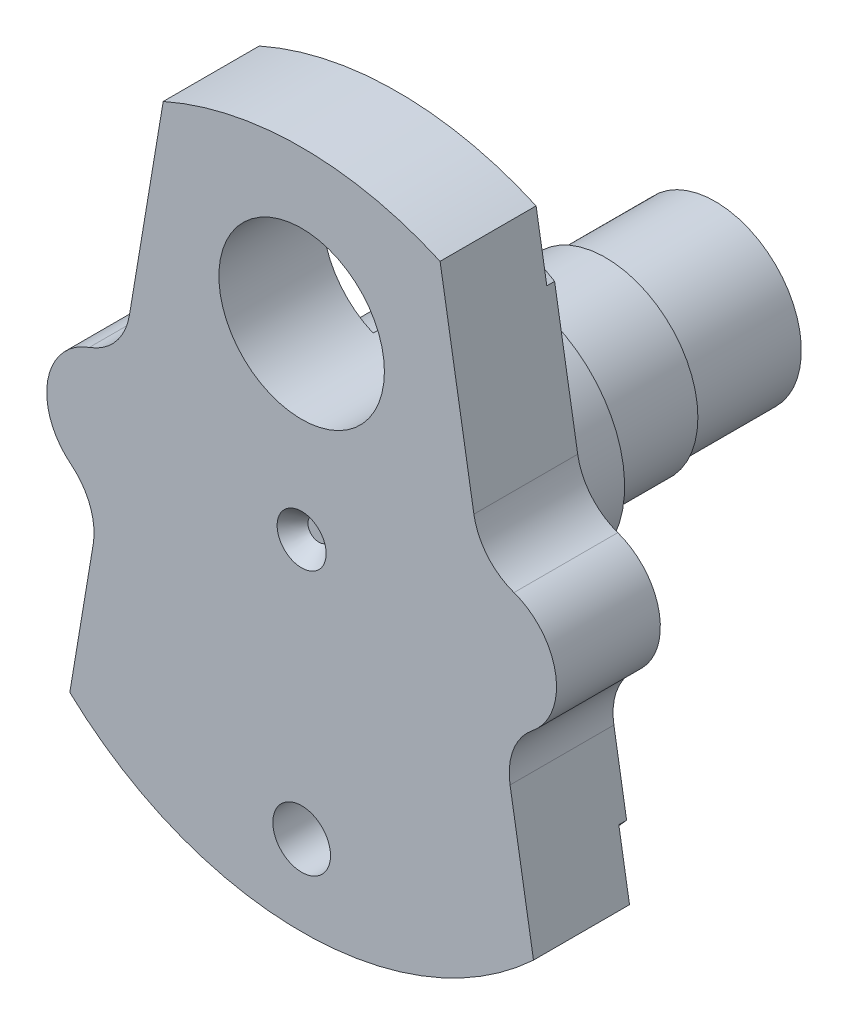
ISO-10303-21;
HEADER;
FILE_DESCRIPTION(('STEP AP214'),'2;1');
FILE_NAME('part.step','',(''),(''),'','','');
FILE_SCHEMA(('AUTOMOTIVE_DESIGN { 1 0 10303 214 1 1 1 1 }'));
ENDSEC;
DATA;
#1=APPLICATION_CONTEXT('core data for automotive mechanical design processes');
#2=APPLICATION_PROTOCOL_DEFINITION('international standard','automotive_design',2000,#1);
#3=PRODUCT_CONTEXT('',#1,'mechanical');
#4=PRODUCT('Part','Part','',(#3));
#5=PRODUCT_RELATED_PRODUCT_CATEGORY('part','',(#4));
#6=PRODUCT_DEFINITION_FORMATION('','',#4);
#7=PRODUCT_DEFINITION_CONTEXT('part definition',#1,'design');
#8=PRODUCT_DEFINITION('design','',#6,#7);
#9=PRODUCT_DEFINITION_SHAPE('','',#8);
#10=(LENGTH_UNIT() NAMED_UNIT(*) SI_UNIT(.MILLI.,.METRE.));
#11=(NAMED_UNIT(*) PLANE_ANGLE_UNIT() SI_UNIT($,.RADIAN.));
#12=(NAMED_UNIT(*) SI_UNIT($,.STERADIAN.) SOLID_ANGLE_UNIT());
#13=UNCERTAINTY_MEASURE_WITH_UNIT(LENGTH_MEASURE(1.E-05),#10,'distance_accuracy_value','');
#14=(GEOMETRIC_REPRESENTATION_CONTEXT(3) GLOBAL_UNCERTAINTY_ASSIGNED_CONTEXT((#13)) GLOBAL_UNIT_ASSIGNED_CONTEXT((#10,
#11,#12)) REPRESENTATION_CONTEXT('',''));
#15=CARTESIAN_POINT('',(0.,0.,0.));
#16=DIRECTION('',(0.,0.,1.));
#17=DIRECTION('',(1.,0.,0.));
#18=AXIS2_PLACEMENT_3D('',#15,#16,#17);
#19=CARTESIAN_POINT('',(36.1365206861808,-18.7744784222295,-18.));
#20=DIRECTION('',(0.986305164893653,0.164930657259661,0.));
#21=DIRECTION('',(-0.164930657259661,0.986305164893653,0.));
#22=AXIS2_PLACEMENT_3D('',#19,#20,#21);
#23=PLANE('',#22);
#24=DIRECTION('',(0.,0.,1.));
#25=VECTOR('',#24,1.);
#26=CARTESIAN_POINT('',(40.1957522810744,-43.0491715209165,-18.));
#27=LINE('',#26,#25);
#28=CARTESIAN_POINT('',(40.1957522810744,-43.0491715209165,-16.65));
#29=VERTEX_POINT('',#28);
#30=CARTESIAN_POINT('',(40.1957522810744,-43.0491715209165,0.));
#31=VERTEX_POINT('',#30);
#32=EDGE_CURVE('E204',#29,#31,#27,.T.);
#33=ORIENTED_EDGE('',*,*,#32,.F.);
#34=DIRECTION('',(-0.164930657259661,0.986305164893653,0.));
#35=VECTOR('',#34,1.);
#36=CARTESIAN_POINT('',(36.1365206861808,-18.7744784222295,-16.65));
#37=LINE('',#36,#35);
#38=CARTESIAN_POINT('',(38.3431689216786,-31.9705002409534,-16.65));
#39=VERTEX_POINT('',#38);
#40=EDGE_CURVE('E367',#29,#39,#37,.T.);
#41=ORIENTED_EDGE('',*,*,#40,.T.);
#42=DIRECTION('',(0.,0.,-1.));
#43=VECTOR('',#42,1.);
#44=CARTESIAN_POINT('',(38.3431689216786,-31.9705002409534,-16.65));
#45=LINE('',#44,#43);
#46=CARTESIAN_POINT('',(38.3431689216787,-31.9705002409534,-18.));
#47=VERTEX_POINT('',#46);
#48=EDGE_CURVE('E352',#39,#47,#45,.T.);
#49=ORIENTED_EDGE('',*,*,#48,.T.);
#50=DIRECTION('',(-0.164930657259661,0.986305164893653,0.));
#51=VECTOR('',#50,1.);
#52=CARTESIAN_POINT('',(36.1365206861808,-18.7744784222295,-18.));
#53=LINE('',#52,#51);
#54=CARTESIAN_POINT('',(36.1365206861808,-18.7744784222295,-18.));
#55=VERTEX_POINT('',#54);
#56=EDGE_CURVE('E249',#47,#55,#53,.T.);
#57=ORIENTED_EDGE('',*,*,#56,.T.);
#58=DIRECTION('',(0.,0.,1.));
#59=VECTOR('',#58,1.);
#60=CARTESIAN_POINT('',(36.1365206861808,-18.7744784222295,-18.));
#61=LINE('',#60,#59);
#62=CARTESIAN_POINT('',(36.1365206861808,-18.7744784222295,0.));
#63=VERTEX_POINT('',#62);
#64=EDGE_CURVE('E200',#55,#63,#61,.T.);
#65=ORIENTED_EDGE('',*,*,#64,.T.);
#66=DIRECTION('',(-0.164930657259661,0.986305164893653,0.));
#67=VECTOR('',#66,1.);
#68=CARTESIAN_POINT('',(36.1365206861808,-18.7744784222295,0.));
#69=LINE('',#68,#67);
#70=EDGE_CURVE('E226',#31,#63,#69,.T.);
#71=ORIENTED_EDGE('',*,*,#70,.F.);
#72=EDGE_LOOP('',(#33,#41,#49,#57,#65,#71));
#73=FACE_BOUND('',#72,.T.);
#74=ADVANCED_FACE('F45',(#73),#23,.T.);
#75=CARTESIAN_POINT('',(0.,0.,-18.));
#76=DIRECTION('',(0.,0.,1.));
#77=DIRECTION('',(1.,0.,0.));
#78=AXIS2_PLACEMENT_3D('',#75,#76,#77);
#79=CYLINDRICAL_SURFACE('',#78,58.8976202412184);
#80=DIRECTION('',(0.,0.,1.));
#81=VECTOR('',#80,1.);
#82=CARTESIAN_POINT('',(-40.1957522810744,-43.0491715209165,-18.));
#83=LINE('',#82,#81);
#84=CARTESIAN_POINT('',(-40.1957522810744,-43.0491715209165,-16.65));
#85=VERTEX_POINT('',#84);
#86=CARTESIAN_POINT('',(-40.1957522810744,-43.0491715209165,0.));
#87=VERTEX_POINT('',#86);
#88=EDGE_CURVE('E287',#85,#87,#83,.T.);
#89=ORIENTED_EDGE('',*,*,#88,.F.);
#90=CARTESIAN_POINT('',(0.,0.,-16.65));
#91=DIRECTION('',(0.,0.,-1.));
#92=DIRECTION('',(-1.,0.,0.));
#93=AXIS2_PLACEMENT_3D('',#90,#91,#92);
#94=CIRCLE('',#93,58.8976202412184);
#95=EDGE_CURVE('E364',#85,#29,#94,.F.);
#96=ORIENTED_EDGE('',*,*,#95,.T.);
#97=ORIENTED_EDGE('',*,*,#32,.T.);
#98=CARTESIAN_POINT('',(0.,0.,0.));
#99=DIRECTION('',(0.,0.,1.));
#100=DIRECTION('',(1.,0.,0.));
#101=AXIS2_PLACEMENT_3D('',#98,#99,#100);
#102=CIRCLE('',#101,58.8976202412184);
#103=EDGE_CURVE('E281',#87,#31,#102,.T.);
#104=ORIENTED_EDGE('',*,*,#103,.F.);
#105=EDGE_LOOP('',(#89,#96,#97,#104));
#106=FACE_BOUND('',#105,.T.);
#107=ADVANCED_FACE('F401',(#106),#79,.T.);
#108=CARTESIAN_POINT('',(-36.1365206861809,-18.7744784222295,-18.));
#109=DIRECTION('',(-0.986305164893653,0.16493065725966,0.));
#110=DIRECTION('',(-0.16493065725966,-0.986305164893653,0.));
#111=AXIS2_PLACEMENT_3D('',#108,#109,#110);
#112=PLANE('',#111);
#113=DIRECTION('',(0.,0.,-1.));
#114=VECTOR('',#113,1.);
#115=CARTESIAN_POINT('',(-38.3431689216786,-31.9705002409534,-16.65));
#116=LINE('',#115,#114);
#117=CARTESIAN_POINT('',(-38.3431689216786,-31.9705002409534,-18.));
#118=VERTEX_POINT('',#117);
#119=CARTESIAN_POINT('',(-38.3431689216786,-31.9705002409534,-16.65));
#120=VERTEX_POINT('',#119);
#121=EDGE_CURVE('E350',#118,#120,#116,.F.);
#122=ORIENTED_EDGE('',*,*,#121,.T.);
#123=DIRECTION('',(-0.16493065725966,-0.986305164893653,0.));
#124=VECTOR('',#123,1.);
#125=CARTESIAN_POINT('',(-36.1365206861809,-18.7744784222295,-16.65));
#126=LINE('',#125,#124);
#127=EDGE_CURVE('E329',#120,#85,#126,.T.);
#128=ORIENTED_EDGE('',*,*,#127,.T.);
#129=ORIENTED_EDGE('',*,*,#88,.T.);
#130=DIRECTION('',(-0.16493065725966,-0.986305164893653,0.));
#131=VECTOR('',#130,1.);
#132=CARTESIAN_POINT('',(-36.1365206861809,-18.7744784222295,0.));
#133=LINE('',#132,#131);
#134=CARTESIAN_POINT('',(-36.1365206861809,-18.7744784222295,0.));
#135=VERTEX_POINT('',#134);
#136=EDGE_CURVE('E278',#135,#87,#133,.T.);
#137=ORIENTED_EDGE('',*,*,#136,.F.);
#138=DIRECTION('',(0.,0.,1.));
#139=VECTOR('',#138,1.);
#140=CARTESIAN_POINT('',(-36.1365206861809,-18.7744784222295,-18.));
#141=LINE('',#140,#139);
#142=CARTESIAN_POINT('',(-36.1365206861809,-18.7744784222295,-18.));
#143=VERTEX_POINT('',#142);
#144=EDGE_CURVE('E289',#143,#135,#141,.T.);
#145=ORIENTED_EDGE('',*,*,#144,.F.);
#146=DIRECTION('',(-0.16493065725966,-0.986305164893653,0.));
#147=VECTOR('',#146,1.);
#148=CARTESIAN_POINT('',(-36.1365206861809,-18.7744784222295,-18.));
#149=LINE('',#148,#147);
#150=EDGE_CURVE('E246',#143,#118,#149,.T.);
#151=ORIENTED_EDGE('',*,*,#150,.T.);
#152=EDGE_LOOP('',(#122,#128,#129,#137,#145,#151));
#153=FACE_BOUND('',#152,.T.);
#154=ADVANCED_FACE('F408',(#153),#112,.T.);
#155=CARTESIAN_POINT('',(-24.0031466517319,53.7845574574546,-18.));
#156=DIRECTION('',(-0.986305164893653,0.164930657259659,0.));
#157=DIRECTION('',(-0.164930657259659,-0.986305164893653,0.));
#158=AXIS2_PLACEMENT_3D('',#155,#156,#157);
#159=PLANE('',#158);
#160=DIRECTION('',(0.,0.,1.));
#161=VECTOR('',#160,1.);
#162=CARTESIAN_POINT('',(-24.0031466517319,53.7845574574546,-18.));
#163=LINE('',#162,#161);
#164=CARTESIAN_POINT('',(-24.0031466517319,53.7845574574546,-16.65));
#165=VERTEX_POINT('',#164);
#166=CARTESIAN_POINT('',(-24.0031466517319,53.7845574574546,0.));
#167=VERTEX_POINT('',#166);
#168=EDGE_CURVE('E297',#165,#167,#163,.T.);
#169=ORIENTED_EDGE('',*,*,#168,.F.);
#170=DIRECTION('',(-0.164930657259659,-0.986305164893653,0.));
#171=VECTOR('',#170,1.);
#172=CARTESIAN_POINT('',(-24.0031466517319,53.7845574574546,-16.65));
#173=LINE('',#172,#171);
#174=CARTESIAN_POINT('',(-25.8557300111277,42.7058861774915,-16.65));
#175=VERTEX_POINT('',#174);
#176=EDGE_CURVE('E360',#165,#175,#173,.T.);
#177=ORIENTED_EDGE('',*,*,#176,.T.);
#178=DIRECTION('',(0.,0.,-1.));
#179=VECTOR('',#178,1.);
#180=CARTESIAN_POINT('',(-25.8557300111276,42.7058861774915,-16.65));
#181=LINE('',#180,#179);
#182=CARTESIAN_POINT('',(-25.8557300111276,42.7058861774915,-18.));
#183=VERTEX_POINT('',#182);
#184=EDGE_CURVE('E347',#175,#183,#181,.T.);
#185=ORIENTED_EDGE('',*,*,#184,.T.);
#186=DIRECTION('',(-0.164930657259659,-0.986305164893653,0.));
#187=VECTOR('',#186,1.);
#188=CARTESIAN_POINT('',(-24.0031466517319,53.7845574574546,-18.));
#189=LINE('',#188,#187);
#190=CARTESIAN_POINT('',(-29.8621091350193,18.747257211408,-18.));
#191=VERTEX_POINT('',#190);
#192=EDGE_CURVE('E235',#183,#191,#189,.T.);
#193=ORIENTED_EDGE('',*,*,#192,.T.);
#194=DIRECTION('',(0.,0.,1.));
#195=VECTOR('',#194,1.);
#196=CARTESIAN_POINT('',(-29.8621091350193,18.747257211408,-18.));
#197=LINE('',#196,#195);
#198=CARTESIAN_POINT('',(-29.8621091350193,18.747257211408,0.));
#199=VERTEX_POINT('',#198);
#200=EDGE_CURVE('E295',#191,#199,#197,.T.);
#201=ORIENTED_EDGE('',*,*,#200,.T.);
#202=DIRECTION('',(-0.164930657259659,-0.986305164893653,0.));
#203=VECTOR('',#202,1.);
#204=CARTESIAN_POINT('',(-24.0031466517319,53.7845574574546,0.));
#205=LINE('',#204,#203);
#206=EDGE_CURVE('E266',#167,#199,#205,.T.);
#207=ORIENTED_EDGE('',*,*,#206,.F.);
#208=EDGE_LOOP('',(#169,#177,#185,#193,#201,#207));
#209=FACE_BOUND('',#208,.T.);
#210=ADVANCED_FACE('F416',(#209),#159,.T.);
#211=CARTESIAN_POINT('',(0.,0.,-18.));
#212=DIRECTION('',(0.,0.,1.));
#213=DIRECTION('',(1.,0.,0.));
#214=AXIS2_PLACEMENT_3D('',#211,#212,#213);
#215=CYLINDRICAL_SURFACE('',#214,58.8976202412184);
#216=DIRECTION('',(0.,0.,1.));
#217=VECTOR('',#216,1.);
#218=CARTESIAN_POINT('',(24.0031466517319,53.7845574574546,-18.));
#219=LINE('',#218,#217);
#220=CARTESIAN_POINT('',(24.0031466517319,53.7845574574546,-16.65));
#221=VERTEX_POINT('',#220);
#222=CARTESIAN_POINT('',(24.0031466517319,53.7845574574546,0.));
#223=VERTEX_POINT('',#222);
#224=EDGE_CURVE('E299',#221,#223,#219,.T.);
#225=ORIENTED_EDGE('',*,*,#224,.F.);
#226=CARTESIAN_POINT('',(0.,0.,-16.65));
#227=DIRECTION('',(0.,0.,-1.));
#228=DIRECTION('',(-1.,0.,0.));
#229=AXIS2_PLACEMENT_3D('',#226,#227,#228);
#230=CIRCLE('',#229,58.8976202412184);
#231=EDGE_CURVE('E357',#221,#165,#230,.F.);
#232=ORIENTED_EDGE('',*,*,#231,.T.);
#233=ORIENTED_EDGE('',*,*,#168,.T.);
#234=CARTESIAN_POINT('',(0.,0.,0.));
#235=DIRECTION('',(0.,0.,1.));
#236=DIRECTION('',(1.,0.,0.));
#237=AXIS2_PLACEMENT_3D('',#234,#235,#236);
#238=CIRCLE('',#237,58.8976202412184);
#239=EDGE_CURVE('E263',#223,#167,#238,.T.);
#240=ORIENTED_EDGE('',*,*,#239,.F.);
#241=EDGE_LOOP('',(#225,#232,#233,#240));
#242=FACE_BOUND('',#241,.T.);
#243=ADVANCED_FACE('F433',(#242),#215,.T.);
#244=CARTESIAN_POINT('',(24.0031466517319,53.7845574574546,-18.));
#245=DIRECTION('',(0.986305164893653,0.16493065725966,0.));
#246=DIRECTION('',(-0.16493065725966,0.986305164893653,0.));
#247=AXIS2_PLACEMENT_3D('',#244,#245,#246);
#248=PLANE('',#247);
#249=DIRECTION('',(0.,0.,-1.));
#250=VECTOR('',#249,1.);
#251=CARTESIAN_POINT('',(25.8557300111276,42.7058861774915,-16.65));
#252=LINE('',#251,#250);
#253=CARTESIAN_POINT('',(25.8557300111276,42.7058861774915,-18.));
#254=VERTEX_POINT('',#253);
#255=CARTESIAN_POINT('',(25.8557300111276,42.7058861774915,-16.65));
#256=VERTEX_POINT('',#255);
#257=EDGE_CURVE('E67',#254,#256,#252,.F.);
#258=ORIENTED_EDGE('',*,*,#257,.T.);
#259=DIRECTION('',(-0.16493065725966,0.986305164893653,0.));
#260=VECTOR('',#259,1.);
#261=CARTESIAN_POINT('',(24.0031466517319,53.7845574574546,-16.65));
#262=LINE('',#261,#260);
#263=EDGE_CURVE('E354',#256,#221,#262,.T.);
#264=ORIENTED_EDGE('',*,*,#263,.T.);
#265=ORIENTED_EDGE('',*,*,#224,.T.);
#266=DIRECTION('',(-0.16493065725966,0.986305164893653,0.));
#267=VECTOR('',#266,1.);
#268=CARTESIAN_POINT('',(24.0031466517319,53.7845574574546,0.));
#269=LINE('',#268,#267);
#270=CARTESIAN_POINT('',(29.8621091350193,18.747257211408,0.));
#271=VERTEX_POINT('',#270);
#272=EDGE_CURVE('E260',#271,#223,#269,.T.);
#273=ORIENTED_EDGE('',*,*,#272,.F.);
#274=DIRECTION('',(0.,0.,1.));
#275=VECTOR('',#274,1.);
#276=CARTESIAN_POINT('',(29.8621091350193,18.747257211408,-18.));
#277=LINE('',#276,#275);
#278=CARTESIAN_POINT('',(29.8621091350193,18.747257211408,-18.));
#279=VERTEX_POINT('',#278);
#280=EDGE_CURVE('E301',#279,#271,#277,.T.);
#281=ORIENTED_EDGE('',*,*,#280,.F.);
#282=DIRECTION('',(-0.16493065725966,0.986305164893653,0.));
#283=VECTOR('',#282,1.);
#284=CARTESIAN_POINT('',(24.0031466517319,53.7845574574546,-18.));
#285=LINE('',#284,#283);
#286=EDGE_CURVE('E232',#279,#254,#285,.T.);
#287=ORIENTED_EDGE('',*,*,#286,.T.);
#288=EDGE_LOOP('',(#258,#264,#265,#273,#281,#287));
#289=FACE_BOUND('',#288,.T.);
#290=ADVANCED_FACE('F437',(#289),#248,.T.);
#291=CARTESIAN_POINT('',(46.6541045117622,-17.0157205094858,-18.));
#292=DIRECTION('',(0.,0.,1.));
#293=DIRECTION('',(1.,0.,0.));
#294=AXIS2_PLACEMENT_3D('',#291,#292,#293);
#295=PLANE('',#294);
#296=CARTESIAN_POINT('',(0.,0.,-18.));
#297=DIRECTION('',(0.,0.,-1.));
#298=DIRECTION('',(-1.,0.,0.));
#299=AXIS2_PLACEMENT_3D('',#296,#297,#298);
#300=CIRCLE('',#299,20.);
#301=CARTESIAN_POINT('',(5.61703536948605,19.1950231481481,-18.));
#302=VERTEX_POINT('',#301);
#303=CARTESIAN_POINT('',(-5.61703536948605,19.1950231481481,-18.));
#304=VERTEX_POINT('',#303);
#305=EDGE_CURVE('E197',#302,#304,#300,.T.);
#306=ORIENTED_EDGE('',*,*,#305,.F.);
#307=CARTESIAN_POINT('',(0.,32.4,-18.));
#308=DIRECTION('',(0.,0.,1.));
#309=DIRECTION('',(1.,0.,0.));
#310=AXIS2_PLACEMENT_3D('',#307,#308,#309);
#311=CIRCLE('',#310,14.35);
#312=EDGE_CURVE('E217',#302,#304,#311,.T.);
#313=ORIENTED_EDGE('',*,*,#312,.T.);
#314=EDGE_LOOP('',(#306,#313));
#315=FACE_BOUND('',#314,.T.);
#316=CARTESIAN_POINT('',(0.,0.,-18.));
#317=DIRECTION('',(0.,0.,-1.));
#318=DIRECTION('',(-1.,0.,0.));
#319=AXIS2_PLACEMENT_3D('',#316,#317,#318);
#320=CIRCLE('',#319,49.9230556818509);
#321=EDGE_CURVE('E331',#183,#254,#320,.T.);
#322=ORIENTED_EDGE('',*,*,#321,.T.);
#323=ORIENTED_EDGE('',*,*,#286,.F.);
#324=CARTESIAN_POINT('',(40.3903600661843,20.5077988852001,-18.));
#325=DIRECTION('',(0.,0.,-1.));
#326=DIRECTION('',(-1.,0.,0.));
#327=AXIS2_PLACEMENT_3D('',#324,#325,#326);
#328=CIRCLE('',#327,10.674435566096);
#329=CARTESIAN_POINT('',(36.8148877410866,10.4499873783564,-18.));
#330=VERTEX_POINT('',#329);
#331=EDGE_CURVE('E229',#330,#279,#328,.T.);
#332=ORIENTED_EDGE('',*,*,#331,.F.);
#333=CARTESIAN_POINT('',(33.1,0.,-18.));
#334=DIRECTION('',(0.,0.,1.));
#335=DIRECTION('',(-1.,0.,0.));
#336=AXIS2_PLACEMENT_3D('',#333,#334,#335);
#337=CIRCLE('',#336,11.0906549462457);
#338=CARTESIAN_POINT('',(40.0100852229209,-8.67486883754763,-18.));
#339=VERTEX_POINT('',#338);
#340=EDGE_CURVE('E225',#339,#330,#337,.T.);
#341=ORIENTED_EDGE('',*,*,#340,.F.);
#342=CARTESIAN_POINT('',(46.6541045117622,-17.0157205094858,-18.));
#343=DIRECTION('',(0.,0.,-1.));
#344=DIRECTION('',(1.,0.,0.));
#345=AXIS2_PLACEMENT_3D('',#342,#343,#344);
#346=CIRCLE('',#345,10.6636203478823);
#347=EDGE_CURVE('E222',#55,#339,#346,.T.);
#348=ORIENTED_EDGE('',*,*,#347,.F.);
#349=ORIENTED_EDGE('',*,*,#56,.F.);
#350=CARTESIAN_POINT('',(0.55115890773041,-49.9200131457476,-18.));
#351=VERTEX_POINT('',#350);
#352=EDGE_CURVE('E338',#47,#351,#320,.T.);
#353=ORIENTED_EDGE('',*,*,#352,.T.);
#354=CARTESIAN_POINT('',(0.00437996724736428,-44.9499997866061,-18.));
#355=DIRECTION('',(0.,0.,1.));
#356=DIRECTION('',(1.,0.,0.));
#357=AXIS2_PLACEMENT_3D('',#354,#355,#356);
#358=CIRCLE('',#357,4.9999999999801);
#359=CARTESIAN_POINT('',(-0.541430397974819,-49.920119608604,-18.));
#360=VERTEX_POINT('',#359);
#361=EDGE_CURVE('E210',#351,#360,#358,.T.);
#362=ORIENTED_EDGE('',*,*,#361,.T.);
#363=EDGE_CURVE('E191',#360,#118,#320,.T.);
#364=ORIENTED_EDGE('',*,*,#363,.T.);
#365=ORIENTED_EDGE('',*,*,#150,.F.);
#366=CARTESIAN_POINT('',(-46.6541045117622,-17.0157205094858,-18.));
#367=DIRECTION('',(0.,0.,-1.));
#368=DIRECTION('',(-1.,0.,0.));
#369=AXIS2_PLACEMENT_3D('',#366,#367,#368);
#370=CIRCLE('',#369,10.6636203478823);
#371=CARTESIAN_POINT('',(-40.0100852229209,-8.67486883754765,-18.));
#372=VERTEX_POINT('',#371);
#373=EDGE_CURVE('E243',#372,#143,#370,.T.);
#374=ORIENTED_EDGE('',*,*,#373,.F.);
#375=CARTESIAN_POINT('',(-33.1,0.,-18.));
#376=DIRECTION('',(0.,0.,1.));
#377=DIRECTION('',(1.,0.,0.));
#378=AXIS2_PLACEMENT_3D('',#375,#376,#377);
#379=CIRCLE('',#378,11.0906549462457);
#380=CARTESIAN_POINT('',(-36.8148877410867,10.4499873783565,-18.));
#381=VERTEX_POINT('',#380);
#382=EDGE_CURVE('E240',#381,#372,#379,.T.);
#383=ORIENTED_EDGE('',*,*,#382,.F.);
#384=CARTESIAN_POINT('',(-40.3903600661843,20.5077988852001,-18.));
#385=DIRECTION('',(0.,0.,-1.));
#386=DIRECTION('',(1.,0.,0.));
#387=AXIS2_PLACEMENT_3D('',#384,#385,#386);
#388=CIRCLE('',#387,10.674435566096);
#389=EDGE_CURVE('E237',#191,#381,#388,.T.);
#390=ORIENTED_EDGE('',*,*,#389,.F.);
#391=ORIENTED_EDGE('',*,*,#192,.F.);
#392=EDGE_LOOP('',(#322,#323,#332,#341,#348,#349,#353,#362,#364,#365,#374,#383,#390,#391));
#393=FACE_BOUND('',#392,.T.);
#394=ADVANCED_FACE('F342',(#315,#393),#295,.F.);
#395=CARTESIAN_POINT('',(0.00437996724736428,-44.9499997866061,-18.));
#396=DIRECTION('',(0.,0.,1.));
#397=DIRECTION('',(1.,0.,0.));
#398=AXIS2_PLACEMENT_3D('',#395,#396,#397);
#399=CYLINDRICAL_SURFACE('',#398,4.9999999999801);
#400=CARTESIAN_POINT('',(0.00437996724736428,-44.9499997866061,0.));
#401=DIRECTION('',(0.,0.,1.));
#402=DIRECTION('',(1.,0.,0.));
#403=AXIS2_PLACEMENT_3D('',#400,#401,#402);
#404=CIRCLE('',#403,4.9999999999801);
#405=CARTESIAN_POINT('',(5.00437996722746,-44.9499997866061,0.));
#406=VERTEX_POINT('',#405);
#407=EDGE_CURVE('E214',#406,#406,#404,.T.);
#408=ORIENTED_EDGE('',*,*,#407,.T.);
#409=EDGE_LOOP('',(#408));
#410=FACE_BOUND('',#409,.T.);
#411=DIRECTION('',(0.,0.,-1.));
#412=VECTOR('',#411,1.);
#413=CARTESIAN_POINT('',(-0.541430397974831,-49.920119608604,-17.325));
#414=LINE('',#413,#412);
#415=CARTESIAN_POINT('',(-0.541430397974819,-49.920119608604,-16.65));
#416=VERTEX_POINT('',#415);
#417=EDGE_CURVE('E184',#360,#416,#414,.F.);
#418=ORIENTED_EDGE('',*,*,#417,.F.);
#419=ORIENTED_EDGE('',*,*,#361,.F.);
#420=DIRECTION('',(0.,0.,-1.));
#421=VECTOR('',#420,1.);
#422=CARTESIAN_POINT('',(0.551158907730395,-49.9200131457476,-17.325));
#423=LINE('',#422,#421);
#424=CARTESIAN_POINT('',(0.551158907730424,-49.9200131457476,-16.65));
#425=VERTEX_POINT('',#424);
#426=EDGE_CURVE('E199',#425,#351,#423,.T.);
#427=ORIENTED_EDGE('',*,*,#426,.F.);
#428=CARTESIAN_POINT('',(0.00437996724736428,-44.9499997866061,-16.65));
#429=DIRECTION('',(0.,0.,-1.));
#430=DIRECTION('',(-1.,0.,0.));
#431=AXIS2_PLACEMENT_3D('',#428,#429,#430);
#432=CIRCLE('',#431,4.9999999999801);
#433=EDGE_CURVE('E202',#416,#425,#432,.F.);
#434=ORIENTED_EDGE('',*,*,#433,.F.);
#435=EDGE_LOOP('',(#418,#419,#427,#434));
#436=FACE_BOUND('',#435,.T.);
#437=ADVANCED_FACE('F334',(#410,#436),#399,.F.);
#438=CARTESIAN_POINT('',(0.,0.,-71.7));
#439=DIRECTION('',(0.,0.,1.));
#440=DIRECTION('',(1.,0.,0.));
#441=AXIS2_PLACEMENT_3D('',#438,#439,#440);
#442=CYLINDRICAL_SURFACE('',#441,16.);
#443=CARTESIAN_POINT('',(0.,0.,-36.));
#444=DIRECTION('',(0.,0.,-1.));
#445=DIRECTION('',(-1.,0.,0.));
#446=AXIS2_PLACEMENT_3D('',#443,#444,#445);
#447=CIRCLE('',#446,16.);
#448=CARTESIAN_POINT('',(16.,0.,-36.));
#449=VERTEX_POINT('',#448);
#450=EDGE_CURVE('E308',#449,#449,#447,.T.);
#451=CARTESIAN_POINT('',(0.,0.,-52.7));
#452=DIRECTION('',(0.,0.,-1.));
#453=DIRECTION('',(-1.,0.,0.));
#454=AXIS2_PLACEMENT_3D('',#451,#452,#453);
#455=CIRCLE('',#454,16.);
#456=CARTESIAN_POINT('',(16.,0.,-52.7));
#457=VERTEX_POINT('',#456);
#458=EDGE_CURVE('E306',#457,#457,#455,.T.);
#459=CARTESIAN_POINT('',(16.,0.,-36.));
#460=CARTESIAN_POINT('',(16.,0.,-36.1739583333333));
#461=CARTESIAN_POINT('',(16.,0.,-36.3479166666667));
#462=CARTESIAN_POINT('',(16.,0.,-36.6958333333333));
#463=CARTESIAN_POINT('',(16.,0.,-36.8697916666667));
#464=CARTESIAN_POINT('',(16.,0.,-37.2177083333333));
#465=CARTESIAN_POINT('',(16.,0.,-37.3916666666667));
#466=CARTESIAN_POINT('',(16.,0.,-37.7395833333333));
#467=CARTESIAN_POINT('',(16.,0.,-37.9135416666667));
#468=CARTESIAN_POINT('',(16.,0.,-38.2614583333333));
#469=CARTESIAN_POINT('',(16.,0.,-38.4354166666667));
#470=CARTESIAN_POINT('',(16.,0.,-38.7833333333333));
#471=CARTESIAN_POINT('',(16.,0.,-38.9572916666667));
#472=CARTESIAN_POINT('',(16.,0.,-39.3052083333333));
#473=CARTESIAN_POINT('',(16.,0.,-39.4791666666667));
#474=CARTESIAN_POINT('',(16.,0.,-39.8270833333333));
#475=CARTESIAN_POINT('',(16.,0.,-40.0010416666667));
#476=CARTESIAN_POINT('',(16.,0.,-40.3489583333333));
#477=CARTESIAN_POINT('',(16.,0.,-40.5229166666667));
#478=CARTESIAN_POINT('',(16.,0.,-40.8708333333333));
#479=CARTESIAN_POINT('',(16.,0.,-41.0447916666667));
#480=CARTESIAN_POINT('',(16.,0.,-41.3927083333333));
#481=CARTESIAN_POINT('',(16.,0.,-41.5666666666667));
#482=CARTESIAN_POINT('',(16.,0.,-41.9145833333333));
#483=CARTESIAN_POINT('',(16.,0.,-42.0885416666667));
#484=CARTESIAN_POINT('',(16.,0.,-42.4364583333333));
#485=CARTESIAN_POINT('',(16.,0.,-42.6104166666667));
#486=CARTESIAN_POINT('',(16.,0.,-42.9583333333333));
#487=CARTESIAN_POINT('',(16.,0.,-43.1322916666667));
#488=CARTESIAN_POINT('',(16.,0.,-43.4802083333333));
#489=CARTESIAN_POINT('',(16.,0.,-43.6541666666667));
#490=CARTESIAN_POINT('',(16.,0.,-44.0020833333333));
#491=CARTESIAN_POINT('',(16.,0.,-44.1760416666667));
#492=CARTESIAN_POINT('',(16.,0.,-44.5239583333333));
#493=CARTESIAN_POINT('',(16.,0.,-44.6979166666667));
#494=CARTESIAN_POINT('',(16.,0.,-45.0458333333333));
#495=CARTESIAN_POINT('',(16.,0.,-45.2197916666667));
#496=CARTESIAN_POINT('',(16.,0.,-45.5677083333333));
#497=CARTESIAN_POINT('',(16.,0.,-45.7416666666667));
#498=CARTESIAN_POINT('',(16.,0.,-46.0895833333333));
#499=CARTESIAN_POINT('',(16.,0.,-46.2635416666667));
#500=CARTESIAN_POINT('',(16.,0.,-46.6114583333333));
#501=CARTESIAN_POINT('',(16.,0.,-46.7854166666667));
#502=CARTESIAN_POINT('',(16.,0.,-47.1333333333333));
#503=CARTESIAN_POINT('',(16.,0.,-47.3072916666667));
#504=CARTESIAN_POINT('',(16.,0.,-47.6552083333333));
#505=CARTESIAN_POINT('',(16.,0.,-47.8291666666667));
#506=CARTESIAN_POINT('',(16.,0.,-48.1770833333333));
#507=CARTESIAN_POINT('',(16.,0.,-48.3510416666667));
#508=CARTESIAN_POINT('',(16.,0.,-48.6989583333333));
#509=CARTESIAN_POINT('',(16.,0.,-48.8729166666667));
#510=CARTESIAN_POINT('',(16.,0.,-49.2208333333333));
#511=CARTESIAN_POINT('',(16.,0.,-49.3947916666667));
#512=CARTESIAN_POINT('',(16.,0.,-49.7427083333333));
#513=CARTESIAN_POINT('',(16.,0.,-49.9166666666667));
#514=CARTESIAN_POINT('',(16.,0.,-50.2645833333333));
#515=CARTESIAN_POINT('',(16.,0.,-50.4385416666667));
#516=CARTESIAN_POINT('',(16.,0.,-50.7864583333333));
#517=CARTESIAN_POINT('',(16.,0.,-50.9604166666667));
#518=CARTESIAN_POINT('',(16.,0.,-51.3083333333333));
#519=CARTESIAN_POINT('',(16.,0.,-51.4822916666667));
#520=CARTESIAN_POINT('',(16.,0.,-51.8302083333333));
#521=CARTESIAN_POINT('',(16.,0.,-52.0041666666667));
#522=CARTESIAN_POINT('',(16.,0.,-52.3520833333333));
#523=CARTESIAN_POINT('',(16.,0.,-52.5260416666667));
#524=CARTESIAN_POINT('',(16.,0.,-52.7));
#525=B_SPLINE_CURVE_WITH_KNOTS('',3,(#459,#460,#461,#462,#463,#464,#465,#466,#467,#468,#469,
#470,#471,#472,#473,#474,#475,#476,#477,#478,#479,#480,#481,#482,#483,#484,#485,#486,#487,#488,
#489,#490,#491,#492,#493,#494,#495,#496,#497,#498,#499,#500,#501,#502,#503,#504,#505,#506,#507,
#508,#509,#510,#511,#512,#513,#514,#515,#516,#517,#518,#519,#520,#521,#522,#523,#524),
.UNSPECIFIED.,.F.,.F.,(4,2,2,2,2,2,2,2,2,2,2,2,2,2,2,2,2,2,2,2,2,2,2,2,2,2,2,2,2,2,2,2,4),(0.,
0.521874999999998,1.04375,1.565625,2.0875,2.609375,3.13125,3.653125,4.175,4.696875,5.21875,
5.74062499999999,6.2625,6.784375,7.30624999999999,7.828125,8.35,8.87187499999999,9.39375,
9.91562499999999,10.4375,10.959375,11.48125,12.003125,12.525,13.046875,13.56875,14.090625,
14.6125,15.134375,15.65625,16.178125,16.7),.UNSPECIFIED.);
#526=EDGE_CURVE('BSEAM510',#449,#457,#525,.T.);
#527=ORIENTED_EDGE('',*,*,#450,.T.);
#528=ORIENTED_EDGE('',*,*,#458,.F.);
#529=ORIENTED_EDGE('',*,*,#526,.T.);
#530=ORIENTED_EDGE('',*,*,#526,.F.);
#531=EDGE_LOOP('',(#527,#529,#528,#530));
#532=FACE_BOUND('',#531,.T.);
#533=ADVANCED_FACE('F510',(#532),#442,.T.);
#534=CARTESIAN_POINT('',(46.6541045117622,-17.0157205094858,-18.));
#535=DIRECTION('',(0.,0.,1.));
#536=DIRECTION('',(1.,0.,0.));
#537=AXIS2_PLACEMENT_3D('',#534,#535,#536);
#538=CYLINDRICAL_SURFACE('',#537,10.6636203478823);
#539=CARTESIAN_POINT('',(46.6541045117622,-17.0157205094858,0.));
#540=DIRECTION('',(0.,0.,-1.));
#541=DIRECTION('',(1.,0.,0.));
#542=AXIS2_PLACEMENT_3D('',#539,#540,#541);
#543=CIRCLE('',#542,10.6636203478823);
#544=CARTESIAN_POINT('',(40.0100852229209,-8.67486883754763,0.));
#545=VERTEX_POINT('',#544);
#546=EDGE_CURVE('E219',#63,#545,#543,.T.);
#547=ORIENTED_EDGE('',*,*,#546,.F.);
#548=ORIENTED_EDGE('',*,*,#64,.F.);
#549=ORIENTED_EDGE('',*,*,#347,.T.);
#550=DIRECTION('',(0.,0.,1.));
#551=VECTOR('',#550,1.);
#552=CARTESIAN_POINT('',(40.0100852229209,-8.67486883754763,-18.));
#553=LINE('',#552,#551);
#554=EDGE_CURVE('E251',#339,#545,#553,.T.);
#555=ORIENTED_EDGE('',*,*,#554,.T.);
#556=EDGE_LOOP('',(#547,#548,#549,#555));
#557=FACE_BOUND('',#556,.T.);
#558=ADVANCED_FACE('F47',(#557),#538,.F.);
#559=CARTESIAN_POINT('',(-46.6541045117622,-17.0157205094858,-18.));
#560=DIRECTION('',(0.,0.,1.));
#561=DIRECTION('',(1.,0.,0.));
#562=AXIS2_PLACEMENT_3D('',#559,#560,#561);
#563=CYLINDRICAL_SURFACE('',#562,10.6636203478823);
#564=CARTESIAN_POINT('',(-46.6541045117622,-17.0157205094858,0.));
#565=DIRECTION('',(0.,0.,-1.));
#566=DIRECTION('',(-1.,0.,0.));
#567=AXIS2_PLACEMENT_3D('',#564,#565,#566);
#568=CIRCLE('',#567,10.6636203478823);
#569=CARTESIAN_POINT('',(-40.0100852229209,-8.67486883754765,0.));
#570=VERTEX_POINT('',#569);
#571=EDGE_CURVE('E275',#570,#135,#568,.T.);
#572=ORIENTED_EDGE('',*,*,#571,.F.);
#573=DIRECTION('',(0.,0.,1.));
#574=VECTOR('',#573,1.);
#575=CARTESIAN_POINT('',(-40.0100852229209,-8.67486883754765,-18.));
#576=LINE('',#575,#574);
#577=EDGE_CURVE('E291',#372,#570,#576,.T.);
#578=ORIENTED_EDGE('',*,*,#577,.F.);
#579=ORIENTED_EDGE('',*,*,#373,.T.);
#580=ORIENTED_EDGE('',*,*,#144,.T.);
#581=EDGE_LOOP('',(#572,#578,#579,#580));
#582=FACE_BOUND('',#581,.T.);
#583=ADVANCED_FACE('F418',(#582),#563,.F.);
#584=CARTESIAN_POINT('',(-33.1,0.,-18.));
#585=DIRECTION('',(0.,0.,1.));
#586=DIRECTION('',(1.,0.,0.));
#587=AXIS2_PLACEMENT_3D('',#584,#585,#586);
#588=CYLINDRICAL_SURFACE('',#587,11.0906549462457);
#589=CARTESIAN_POINT('',(-33.1,0.,0.));
#590=DIRECTION('',(0.,0.,1.));
#591=DIRECTION('',(1.,0.,0.));
#592=AXIS2_PLACEMENT_3D('',#589,#590,#591);
#593=CIRCLE('',#592,11.0906549462457);
#594=CARTESIAN_POINT('',(-36.8148877410867,10.4499873783565,0.));
#595=VERTEX_POINT('',#594);
#596=EDGE_CURVE('E272',#595,#570,#593,.T.);
#597=ORIENTED_EDGE('',*,*,#596,.F.);
#598=DIRECTION('',(0.,0.,1.));
#599=VECTOR('',#598,1.);
#600=CARTESIAN_POINT('',(-36.8148877410867,10.4499873783565,-18.));
#601=LINE('',#600,#599);
#602=EDGE_CURVE('E293',#381,#595,#601,.T.);
#603=ORIENTED_EDGE('',*,*,#602,.F.);
#604=ORIENTED_EDGE('',*,*,#382,.T.);
#605=ORIENTED_EDGE('',*,*,#577,.T.);
#606=EDGE_LOOP('',(#597,#603,#604,#605));
#607=FACE_BOUND('',#606,.T.);
#608=ADVANCED_FACE('F421',(#607),#588,.T.);
#609=CARTESIAN_POINT('',(-40.3903600661843,20.5077988852001,-18.));
#610=DIRECTION('',(0.,0.,1.));
#611=DIRECTION('',(1.,0.,0.));
#612=AXIS2_PLACEMENT_3D('',#609,#610,#611);
#613=CYLINDRICAL_SURFACE('',#612,10.674435566096);
#614=CARTESIAN_POINT('',(-40.3903600661843,20.5077988852001,0.));
#615=DIRECTION('',(0.,0.,-1.));
#616=DIRECTION('',(1.,0.,0.));
#617=AXIS2_PLACEMENT_3D('',#614,#615,#616);
#618=CIRCLE('',#617,10.674435566096);
#619=EDGE_CURVE('E269',#199,#595,#618,.T.);
#620=ORIENTED_EDGE('',*,*,#619,.F.);
#621=ORIENTED_EDGE('',*,*,#200,.F.);
#622=ORIENTED_EDGE('',*,*,#389,.T.);
#623=ORIENTED_EDGE('',*,*,#602,.T.);
#624=EDGE_LOOP('',(#620,#621,#622,#623));
#625=FACE_BOUND('',#624,.T.);
#626=ADVANCED_FACE('F425',(#625),#613,.F.);
#627=CARTESIAN_POINT('',(40.3903600661843,20.5077988852001,-18.));
#628=DIRECTION('',(0.,0.,1.));
#629=DIRECTION('',(1.,0.,0.));
#630=AXIS2_PLACEMENT_3D('',#627,#628,#629);
#631=CYLINDRICAL_SURFACE('',#630,10.674435566096);
#632=CARTESIAN_POINT('',(40.3903600661843,20.5077988852001,0.));
#633=DIRECTION('',(0.,0.,-1.));
#634=DIRECTION('',(-1.,0.,0.));
#635=AXIS2_PLACEMENT_3D('',#632,#633,#634);
#636=CIRCLE('',#635,10.674435566096);
#637=CARTESIAN_POINT('',(36.8148877410866,10.4499873783564,0.));
#638=VERTEX_POINT('',#637);
#639=EDGE_CURVE('E257',#638,#271,#636,.T.);
#640=ORIENTED_EDGE('',*,*,#639,.F.);
#641=DIRECTION('',(0.,0.,1.));
#642=VECTOR('',#641,1.);
#643=CARTESIAN_POINT('',(36.8148877410866,10.4499873783564,-18.));
#644=LINE('',#643,#642);
#645=EDGE_CURVE('E303',#330,#638,#644,.T.);
#646=ORIENTED_EDGE('',*,*,#645,.F.);
#647=ORIENTED_EDGE('',*,*,#331,.T.);
#648=ORIENTED_EDGE('',*,*,#280,.T.);
#649=EDGE_LOOP('',(#640,#646,#647,#648));
#650=FACE_BOUND('',#649,.T.);
#651=ADVANCED_FACE('F429',(#650),#631,.F.);
#652=CARTESIAN_POINT('',(33.1,0.,-18.));
#653=DIRECTION('',(0.,0.,1.));
#654=DIRECTION('',(1.,0.,0.));
#655=AXIS2_PLACEMENT_3D('',#652,#653,#654);
#656=CYLINDRICAL_SURFACE('',#655,11.0906549462457);
#657=CARTESIAN_POINT('',(33.1,0.,0.));
#658=DIRECTION('',(0.,0.,1.));
#659=DIRECTION('',(-1.,0.,0.));
#660=AXIS2_PLACEMENT_3D('',#657,#658,#659);
#661=CIRCLE('',#660,11.0906549462457);
#662=EDGE_CURVE('E254',#545,#638,#661,.T.);
#663=ORIENTED_EDGE('',*,*,#662,.F.);
#664=ORIENTED_EDGE('',*,*,#554,.F.);
#665=ORIENTED_EDGE('',*,*,#340,.T.);
#666=ORIENTED_EDGE('',*,*,#645,.T.);
#667=EDGE_LOOP('',(#663,#664,#665,#666));
#668=FACE_BOUND('',#667,.T.);
#669=ADVANCED_FACE('F443',(#668),#656,.T.);
#670=CARTESIAN_POINT('',(46.6541045117622,-17.0157205094858,0.));
#671=DIRECTION('',(0.,0.,1.));
#672=DIRECTION('',(1.,0.,0.));
#673=AXIS2_PLACEMENT_3D('',#670,#671,#672);
#674=PLANE('',#673);
#675=CARTESIAN_POINT('',(0.,0.,0.));
#676=DIRECTION('',(0.,0.,1.));
#677=DIRECTION('',(1.,0.,0.));
#678=AXIS2_PLACEMENT_3D('',#675,#676,#677);
#679=CIRCLE('',#678,4.25);
#680=CARTESIAN_POINT('',(4.25,0.,0.));
#681=VERTEX_POINT('',#680);
#682=EDGE_CURVE('E370',#681,#681,#679,.T.);
#683=ORIENTED_EDGE('',*,*,#682,.F.);
#684=EDGE_LOOP('',(#683));
#685=FACE_BOUND('',#684,.T.);
#686=ORIENTED_EDGE('',*,*,#407,.F.);
#687=EDGE_LOOP('',(#686));
#688=FACE_BOUND('',#687,.T.);
#689=CARTESIAN_POINT('',(0.,32.4,0.));
#690=DIRECTION('',(0.,0.,1.));
#691=DIRECTION('',(1.,0.,0.));
#692=AXIS2_PLACEMENT_3D('',#689,#690,#691);
#693=CIRCLE('',#692,14.35);
#694=CARTESIAN_POINT('',(14.35,32.4,0.));
#695=VERTEX_POINT('',#694);
#696=EDGE_CURVE('E213',#695,#695,#693,.T.);
#697=ORIENTED_EDGE('',*,*,#696,.F.);
#698=EDGE_LOOP('',(#697));
#699=FACE_BOUND('',#698,.T.);
#700=ORIENTED_EDGE('',*,*,#546,.T.);
#701=ORIENTED_EDGE('',*,*,#662,.T.);
#702=ORIENTED_EDGE('',*,*,#639,.T.);
#703=ORIENTED_EDGE('',*,*,#272,.T.);
#704=ORIENTED_EDGE('',*,*,#239,.T.);
#705=ORIENTED_EDGE('',*,*,#206,.T.);
#706=ORIENTED_EDGE('',*,*,#619,.T.);
#707=ORIENTED_EDGE('',*,*,#596,.T.);
#708=ORIENTED_EDGE('',*,*,#571,.T.);
#709=ORIENTED_EDGE('',*,*,#136,.T.);
#710=ORIENTED_EDGE('',*,*,#103,.T.);
#711=ORIENTED_EDGE('',*,*,#70,.T.);
#712=EDGE_LOOP('',(#700,#701,#702,#703,#704,#705,#706,#707,#708,#709,#710,#711));
#713=FACE_BOUND('',#712,.T.);
#714=ADVANCED_FACE('F397',(#685,#688,#699,#713),#674,.T.);
#715=CARTESIAN_POINT('',(0.,32.4,-18.));
#716=DIRECTION('',(0.,0.,1.));
#717=DIRECTION('',(1.,0.,0.));
#718=AXIS2_PLACEMENT_3D('',#715,#716,#717);
#719=CYLINDRICAL_SURFACE('',#718,14.35);
#720=ORIENTED_EDGE('',*,*,#312,.F.);
#721=DIRECTION('',(0.,0.,1.));
#722=VECTOR('',#721,1.);
#723=CARTESIAN_POINT('',(5.61703536948605,19.1950231481481,-10.85));
#724=LINE('',#723,#722);
#725=CARTESIAN_POINT('',(5.61703536948605,19.1950231481481,-21.7));
#726=VERTEX_POINT('',#725);
#727=EDGE_CURVE('E53',#726,#302,#724,.T.);
#728=ORIENTED_EDGE('',*,*,#727,.F.);
#729=CARTESIAN_POINT('',(0.,32.4,-21.7));
#730=DIRECTION('',(0.,0.,1.));
#731=DIRECTION('',(1.,0.,0.));
#732=AXIS2_PLACEMENT_3D('',#729,#730,#731);
#733=CIRCLE('',#732,14.35);
#734=CARTESIAN_POINT('',(-5.61703536948605,19.1950231481481,-21.7));
#735=VERTEX_POINT('',#734);
#736=EDGE_CURVE('E59',#735,#726,#733,.T.);
#737=ORIENTED_EDGE('',*,*,#736,.F.);
#738=DIRECTION('',(0.,0.,1.));
#739=VECTOR('',#738,1.);
#740=CARTESIAN_POINT('',(-5.61703536948605,19.1950231481481,-10.85));
#741=LINE('',#740,#739);
#742=EDGE_CURVE('E12',#304,#735,#741,.F.);
#743=ORIENTED_EDGE('',*,*,#742,.F.);
#744=EDGE_LOOP('',(#720,#728,#737,#743));
#745=FACE_BOUND('',#744,.T.);
#746=ORIENTED_EDGE('',*,*,#696,.T.);
#747=EDGE_LOOP('',(#746));
#748=FACE_BOUND('',#747,.T.);
#749=ADVANCED_FACE('F188',(#745,#748),#719,.F.);
#750=CARTESIAN_POINT('',(0.,0.,-36.));
#751=DIRECTION('',(0.,0.,1.));
#752=DIRECTION('',(1.,0.,0.));
#753=AXIS2_PLACEMENT_3D('',#750,#751,#752);
#754=CYLINDRICAL_SURFACE('',#753,20.);
#755=ORIENTED_EDGE('',*,*,#305,.T.);
#756=ORIENTED_EDGE('',*,*,#742,.T.);
#757=CARTESIAN_POINT('',(0.,0.,-21.7));
#758=DIRECTION('',(0.,0.,1.));
#759=DIRECTION('',(1.,0.,0.));
#760=AXIS2_PLACEMENT_3D('',#757,#758,#759);
#761=CIRCLE('',#760,20.);
#762=EDGE_CURVE('E181',#726,#735,#761,.T.);
#763=ORIENTED_EDGE('',*,*,#762,.F.);
#764=ORIENTED_EDGE('',*,*,#727,.T.);
#765=EDGE_LOOP('',(#755,#756,#763,#764));
#766=FACE_BOUND('',#765,.T.);
#767=CARTESIAN_POINT('',(0.,0.,-36.));
#768=DIRECTION('',(0.,0.,-1.));
#769=DIRECTION('',(-1.,0.,0.));
#770=AXIS2_PLACEMENT_3D('',#767,#768,#769);
#771=CIRCLE('',#770,20.);
#772=CARTESIAN_POINT('',(-20.,0.,-36.));
#773=VERTEX_POINT('',#772);
#774=EDGE_CURVE('E208',#773,#773,#771,.T.);
#775=ORIENTED_EDGE('',*,*,#774,.F.);
#776=EDGE_LOOP('',(#775));
#777=FACE_BOUND('',#776,.T.);
#778=ADVANCED_FACE('F194',(#766,#777),#754,.T.);
#779=CARTESIAN_POINT('',(0.,0.,-36.));
#780=DIRECTION('',(0.,0.,-1.));
#781=DIRECTION('',(-1.,0.,0.));
#782=AXIS2_PLACEMENT_3D('',#779,#780,#781);
#783=PLANE('',#782);
#784=ORIENTED_EDGE('',*,*,#450,.F.);
#785=EDGE_LOOP('',(#784));
#786=FACE_BOUND('',#785,.T.);
#787=ORIENTED_EDGE('',*,*,#774,.T.);
#788=EDGE_LOOP('',(#787));
#789=FACE_BOUND('',#788,.T.);
#790=ADVANCED_FACE('F386',(#786,#789),#783,.T.);
#791=CARTESIAN_POINT('',(0.,0.,-52.7));
#792=DIRECTION('',(0.,0.,-1.));
#793=DIRECTION('',(-1.,0.,0.));
#794=AXIS2_PLACEMENT_3D('',#791,#792,#793);
#795=PLANE('',#794);
#796=CARTESIAN_POINT('',(0.,0.,-52.7));
#797=DIRECTION('',(0.,0.,-1.));
#798=DIRECTION('',(-1.,0.,0.));
#799=AXIS2_PLACEMENT_3D('',#796,#797,#798);
#800=CIRCLE('',#799,14.935);
#801=CARTESIAN_POINT('',(-14.935,0.,-52.7));
#802=VERTEX_POINT('',#801);
#803=EDGE_CURVE('E309',#802,#802,#800,.T.);
#804=ORIENTED_EDGE('',*,*,#803,.F.);
#805=EDGE_LOOP('',(#804));
#806=FACE_BOUND('',#805,.T.);
#807=ORIENTED_EDGE('',*,*,#458,.T.);
#808=EDGE_LOOP('',(#807));
#809=FACE_BOUND('',#808,.T.);
#810=ADVANCED_FACE('F394',(#806,#809),#795,.T.);
#811=CARTESIAN_POINT('',(0.,0.,-52.7));
#812=DIRECTION('',(0.,0.,-1.));
#813=DIRECTION('',(-1.,0.,0.));
#814=AXIS2_PLACEMENT_3D('',#811,#812,#813);
#815=CYLINDRICAL_SURFACE('',#814,14.935);
#816=ORIENTED_EDGE('',*,*,#803,.T.);
#817=EDGE_LOOP('',(#816));
#818=FACE_BOUND('',#817,.T.);
#819=CARTESIAN_POINT('',(0.,0.,-71.7));
#820=DIRECTION('',(0.,0.,-1.));
#821=DIRECTION('',(-1.,0.,0.));
#822=AXIS2_PLACEMENT_3D('',#819,#820,#821);
#823=CIRCLE('',#822,14.935);
#824=CARTESIAN_POINT('',(-14.935,0.,-71.7));
#825=VERTEX_POINT('',#824);
#826=EDGE_CURVE('E376',#825,#825,#823,.T.);
#827=ORIENTED_EDGE('',*,*,#826,.F.);
#828=EDGE_LOOP('',(#827));
#829=FACE_BOUND('',#828,.T.);
#830=ADVANCED_FACE('F500',(#818,#829),#815,.T.);
#831=CARTESIAN_POINT('',(0.,0.,-71.7));
#832=DIRECTION('',(0.,0.,-1.));
#833=DIRECTION('',(-1.,0.,0.));
#834=AXIS2_PLACEMENT_3D('',#831,#832,#833);
#835=PLANE('',#834);
#836=ORIENTED_EDGE('',*,*,#826,.T.);
#837=EDGE_LOOP('',(#836));
#838=FACE_BOUND('',#837,.T.);
#839=ADVANCED_FACE('F498',(#838),#835,.T.);
#840=CARTESIAN_POINT('',(0.,0.,0.));
#841=DIRECTION('',(0.,0.,1.));
#842=DIRECTION('',(1.,0.,0.));
#843=AXIS2_PLACEMENT_3D('',#840,#841,#842);
#844=CONICAL_SURFACE('',#843,4.25,0.663225115757846);
#845=CARTESIAN_POINT('',(0.,0.,-3.));
#846=DIRECTION('',(0.,0.,1.));
#847=DIRECTION('',(1.,0.,0.));
#848=AXIS2_PLACEMENT_3D('',#845,#846,#847);
#849=CIRCLE('',#848,1.90614312047984);
#850=CARTESIAN_POINT('',(1.90614312047984,0.,-3.));
#851=VERTEX_POINT('',#850);
#852=EDGE_CURVE('E373',#851,#851,#849,.T.);
#853=ORIENTED_EDGE('',*,*,#852,.F.);
#854=EDGE_LOOP('',(#853));
#855=FACE_BOUND('',#854,.T.);
#856=ORIENTED_EDGE('',*,*,#682,.T.);
#857=EDGE_LOOP('',(#856));
#858=FACE_BOUND('',#857,.T.);
#859=ADVANCED_FACE('F494',(#855,#858),#844,.F.);
#860=CARTESIAN_POINT('',(0.,0.,-3.));
#861=DIRECTION('',(0.,0.,1.));
#862=DIRECTION('',(1.,0.,0.));
#863=AXIS2_PLACEMENT_3D('',#860,#861,#862);
#864=PLANE('',#863);
#865=ORIENTED_EDGE('',*,*,#852,.T.);
#866=EDGE_LOOP('',(#865));
#867=FACE_BOUND('',#866,.T.);
#868=ADVANCED_FACE('F491',(#867),#864,.T.);
#869=CARTESIAN_POINT('',(0.,0.,-16.65));
#870=DIRECTION('',(0.,0.,-1.));
#871=DIRECTION('',(-1.,0.,0.));
#872=AXIS2_PLACEMENT_3D('',#869,#870,#871);
#873=CYLINDRICAL_SURFACE('',#872,49.9230556818509);
#874=ORIENTED_EDGE('',*,*,#363,.F.);
#875=ORIENTED_EDGE('',*,*,#417,.T.);
#876=CARTESIAN_POINT('',(0.,0.,-16.65));
#877=DIRECTION('',(0.,0.,-1.));
#878=DIRECTION('',(-1.,0.,0.));
#879=AXIS2_PLACEMENT_3D('',#876,#877,#878);
#880=CIRCLE('',#879,49.9230556818509);
#881=EDGE_CURVE('E318',#416,#120,#880,.T.);
#882=ORIENTED_EDGE('',*,*,#881,.T.);
#883=ORIENTED_EDGE('',*,*,#121,.F.);
#884=EDGE_LOOP('',(#874,#875,#882,#883));
#885=FACE_BOUND('',#884,.T.);
#886=ADVANCED_FACE('F317',(#885),#873,.T.);
#887=EDGE_CURVE('E330',#39,#425,#880,.T.);
#888=ORIENTED_EDGE('',*,*,#887,.T.);
#889=ORIENTED_EDGE('',*,*,#426,.T.);
#890=ORIENTED_EDGE('',*,*,#352,.F.);
#891=ORIENTED_EDGE('',*,*,#48,.F.);
#892=EDGE_LOOP('',(#888,#889,#890,#891));
#893=FACE_BOUND('',#892,.T.);
#894=ADVANCED_FACE('F337',(#893),#873,.T.);
#895=CARTESIAN_POINT('',(0.,0.,-16.65));
#896=DIRECTION('',(0.,0.,-1.));
#897=DIRECTION('',(-1.,0.,0.));
#898=AXIS2_PLACEMENT_3D('',#895,#896,#897);
#899=PLANE('',#898);
#900=ORIENTED_EDGE('',*,*,#95,.F.);
#901=ORIENTED_EDGE('',*,*,#127,.F.);
#902=ORIENTED_EDGE('',*,*,#881,.F.);
#903=ORIENTED_EDGE('',*,*,#433,.T.);
#904=ORIENTED_EDGE('',*,*,#887,.F.);
#905=ORIENTED_EDGE('',*,*,#40,.F.);
#906=EDGE_LOOP('',(#900,#901,#902,#903,#904,#905));
#907=FACE_BOUND('',#906,.T.);
#908=ADVANCED_FACE('F325',(#907),#899,.T.);
#909=ORIENTED_EDGE('',*,*,#231,.F.);
#910=ORIENTED_EDGE('',*,*,#263,.F.);
#911=EDGE_CURVE('E333',#175,#256,#880,.T.);
#912=ORIENTED_EDGE('',*,*,#911,.F.);
#913=ORIENTED_EDGE('',*,*,#176,.F.);
#914=EDGE_LOOP('',(#909,#910,#912,#913));
#915=FACE_BOUND('',#914,.T.);
#916=ADVANCED_FACE('F481',(#915),#899,.T.);
#917=ORIENTED_EDGE('',*,*,#911,.T.);
#918=ORIENTED_EDGE('',*,*,#257,.F.);
#919=ORIENTED_EDGE('',*,*,#321,.F.);
#920=ORIENTED_EDGE('',*,*,#184,.F.);
#921=EDGE_LOOP('',(#917,#918,#919,#920));
#922=FACE_BOUND('',#921,.T.);
#923=ADVANCED_FACE('F479',(#922),#873,.T.);
#924=CARTESIAN_POINT('',(0.,32.4,-21.7));
#925=DIRECTION('',(0.,0.,1.));
#926=DIRECTION('',(1.,0.,0.));
#927=AXIS2_PLACEMENT_3D('',#924,#925,#926);
#928=PLANE('',#927);
#929=ORIENTED_EDGE('',*,*,#762,.T.);
#930=ORIENTED_EDGE('',*,*,#736,.T.);
#931=EDGE_LOOP('',(#929,#930));
#932=FACE_BOUND('',#931,.T.);
#933=ADVANCED_FACE('F182',(#932),#928,.T.);
#934=CLOSED_SHELL('',(#74,#107,#154,#210,#243,#290,#394,#437,#533,#558,#583,#608,#626,#651,#669,
#714,#749,#778,#790,#810,#830,#839,#859,#868,#886,#894,#908,#916,#923,#933));
#935=MANIFOLD_SOLID_BREP('B2',#934);
#936=ADVANCED_BREP_SHAPE_REPRESENTATION('',(#18,#935),#14);
#937=SHAPE_DEFINITION_REPRESENTATION(#9,#936);
ENDSEC;
END-ISO-10303-21;
